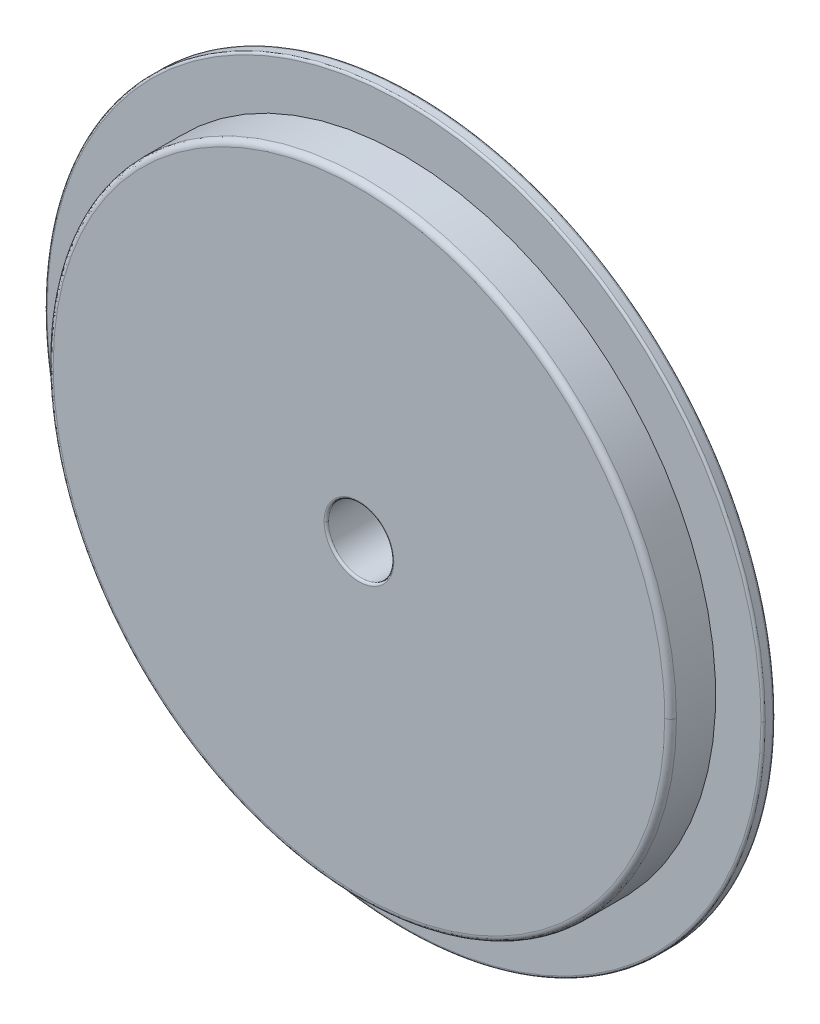
ISO-10303-21;
HEADER;
FILE_DESCRIPTION(('STEP AP214'),'2;1');
FILE_NAME('part.step','',(''),(''),'','','');
FILE_SCHEMA(('AUTOMOTIVE_DESIGN { 1 0 10303 214 1 1 1 1 }'));
ENDSEC;
DATA;
#1=APPLICATION_CONTEXT('core data for automotive mechanical design processes');
#2=APPLICATION_PROTOCOL_DEFINITION('international standard','automotive_design',2000,#1);
#3=PRODUCT_CONTEXT('',#1,'mechanical');
#4=PRODUCT('Part','Part','',(#3));
#5=PRODUCT_RELATED_PRODUCT_CATEGORY('part','',(#4));
#6=PRODUCT_DEFINITION_FORMATION('','',#4);
#7=PRODUCT_DEFINITION_CONTEXT('part definition',#1,'design');
#8=PRODUCT_DEFINITION('design','',#6,#7);
#9=PRODUCT_DEFINITION_SHAPE('','',#8);
#10=(LENGTH_UNIT() NAMED_UNIT(*) SI_UNIT(.MILLI.,.METRE.));
#11=(NAMED_UNIT(*) PLANE_ANGLE_UNIT() SI_UNIT($,.RADIAN.));
#12=(NAMED_UNIT(*) SI_UNIT($,.STERADIAN.) SOLID_ANGLE_UNIT());
#13=UNCERTAINTY_MEASURE_WITH_UNIT(LENGTH_MEASURE(1.E-05),#10,'distance_accuracy_value','');
#14=(GEOMETRIC_REPRESENTATION_CONTEXT(3) GLOBAL_UNCERTAINTY_ASSIGNED_CONTEXT((#13)) GLOBAL_UNIT_ASSIGNED_CONTEXT((#10,
#11,#12)) REPRESENTATION_CONTEXT('',''));
#15=CARTESIAN_POINT('',(0.,0.,0.));
#16=DIRECTION('',(0.,0.,1.));
#17=DIRECTION('',(1.,0.,0.));
#18=AXIS2_PLACEMENT_3D('',#15,#16,#17);
#19=CARTESIAN_POINT('',(-50.4984392112,0.,1.3327900446));
#20=CARTESIAN_POINT('',(-50.4984392112,100.996878397,1.3327900446));
#21=CARTESIAN_POINT('',(50.4984392112,100.996878397,1.3327900446));
#22=CARTESIAN_POINT('',(50.4984392112,0.,1.3327900446));
#23=CARTESIAN_POINT('',(-50.5197513352,0.,1.5452003894));
#24=CARTESIAN_POINT('',(-50.5197513352,101.039502645,1.5452003894));
#25=CARTESIAN_POINT('',(50.5197513352,101.039502645,1.5452003894));
#26=CARTESIAN_POINT('',(50.5197513352,0.,1.5452003894));
#27=CARTESIAN_POINT('',(-50.3688004052,0.,1.6961513194));
#28=CARTESIAN_POINT('',(-50.3688004052,100.737600785,1.6961513194));
#29=CARTESIAN_POINT('',(50.3688004052,100.737600785,1.6961513194));
#30=CARTESIAN_POINT('',(50.3688004052,0.,1.6961513194));
#31=CARTESIAN_POINT('',(-50.156390035,0.,1.6748391954));
#32=CARTESIAN_POINT('',(-50.156390035,100.3127800954,1.6748391954));
#33=CARTESIAN_POINT('',(50.156390035,100.3127800954,1.6748391954));
#34=CARTESIAN_POINT('',(50.156390035,0.,1.6748391954));
#35=(BOUNDED_SURFACE() B_SPLINE_SURFACE(3,3,((#19,#20,#21,#22),(#23,#24,#25,#26),(#27,#28,#29,
#30),(#31,#32,#33,#34)),.UNSPECIFIED.,.F.,.F.,.F.) B_SPLINE_SURFACE_WITH_KNOTS((4,4),(4,4),(0.,
1.),(0.,1.),.UNSPECIFIED.) GEOMETRIC_REPRESENTATION_ITEM() RATIONAL_B_SPLINE_SURFACE(((1.,
0.333333333333333,0.333333333333333,1.),(0.755320871117975,0.251773623705992,0.251773623705992,
0.755320871117975),(0.755320871117975,0.251773623705992,0.251773623705992,0.755320871117975),
(1.,0.333333333333333,0.333333333333333,1.))) REPRESENTATION_ITEM('') SURFACE());
#36=CARTESIAN_POINT('',(0.,0.,1.36398));
#37=DIRECTION('',(0.,0.,-1.));
#38=DIRECTION('',(-1.,0.,0.));
#39=AXIS2_PLACEMENT_3D('',#36,#37,#38);
#40=CIRCLE('',#39,50.4999999904);
#41=CARTESIAN_POINT('',(50.4999999952931,-1.55365847070829E-08,1.36397999989946));
#42=VERTEX_POINT('',#41);
#43=CARTESIAN_POINT('',(-50.4999999952931,-4.534578234789E-09,1.36397999989946));
#44=VERTEX_POINT('',#43);
#45=EDGE_CURVE('E351',#42,#44,#40,.F.);
#46=CARTESIAN_POINT('',(-50.4984392112,0.,1.3327900446));
#47=CARTESIAN_POINT('',(-50.5197513352,0.,1.5452003894));
#48=CARTESIAN_POINT('',(-50.3688004052,0.,1.6961513194));
#49=CARTESIAN_POINT('',(-50.156390035,0.,1.6748391954));
#50=(BOUNDED_CURVE() B_SPLINE_CURVE(3,(#46,#47,#48,#49),.UNSPECIFIED.,.F.,
.F.) B_SPLINE_CURVE_WITH_KNOTS((4,4),(0.,1.),
.UNSPECIFIED.) CURVE() GEOMETRIC_REPRESENTATION_ITEM() RATIONAL_B_SPLINE_CURVE((1.,
0.755320871117975,0.755320871117975,1.)) REPRESENTATION_ITEM(''));
#51=CARTESIAN_POINT('',(-50.1875799769011,0.,1.67639999650745));
#52=VERTEX_POINT('',#51);
#53=EDGE_CURVE('E96',#52,#44,#50,.F.);
#54=CARTESIAN_POINT('',(-50.1875799727355,0.,1.67639999417908));
#55=CARTESIAN_POINT('',(-50.1875799727355,100.375159963739,1.67639999417908));
#56=CARTESIAN_POINT('',(50.1875799727355,100.375159963739,1.67639999417908));
#57=CARTESIAN_POINT('',(50.1875799727355,0.,1.67639999417908));
#58=(BOUNDED_CURVE() B_SPLINE_CURVE(3,(#54,#55,#56,#57),.UNSPECIFIED.,.F.,
.F.) B_SPLINE_CURVE_WITH_KNOTS((4,4),(0.,1.),
.UNSPECIFIED.) CURVE() GEOMETRIC_REPRESENTATION_ITEM() RATIONAL_B_SPLINE_CURVE((0.95657832858148,
0.318859442860493,0.318859442860493,0.95657832858148)) REPRESENTATION_ITEM(''));
#59=CARTESIAN_POINT('',(50.1875799769011,0.,1.67639999650745));
#60=VERTEX_POINT('',#59);
#61=EDGE_CURVE('E90',#52,#60,#58,.T.);
#62=CARTESIAN_POINT('',(50.4984392112,0.,1.3327900446));
#63=CARTESIAN_POINT('',(50.5197513352,0.,1.5452003894));
#64=CARTESIAN_POINT('',(50.3688004052,0.,1.6961513194));
#65=CARTESIAN_POINT('',(50.156390035,0.,1.6748391954));
#66=(BOUNDED_CURVE() B_SPLINE_CURVE(3,(#62,#63,#64,#65),.UNSPECIFIED.,.F.,
.F.) B_SPLINE_CURVE_WITH_KNOTS((4,4),(0.,1.),
.UNSPECIFIED.) CURVE() GEOMETRIC_REPRESENTATION_ITEM() RATIONAL_B_SPLINE_CURVE((1.,
0.755320871117975,0.755320871117975,1.)) REPRESENTATION_ITEM(''));
#67=EDGE_CURVE('E93',#42,#60,#66,.T.);
#68=ORIENTED_EDGE('',*,*,#45,.T.);
#69=ORIENTED_EDGE('',*,*,#53,.F.);
#70=ORIENTED_EDGE('',*,*,#61,.T.);
#71=ORIENTED_EDGE('',*,*,#67,.F.);
#72=EDGE_LOOP('',(#68,#69,#70,#71));
#73=FACE_BOUND('',#72,.T.);
#74=ADVANCED_FACE('F16',(#73),#35,.T.);
#75=CARTESIAN_POINT('',(50.4984392112,0.,1.3327900446));
#76=CARTESIAN_POINT('',(50.4984392112,-100.996878397,1.3327900446));
#77=CARTESIAN_POINT('',(-50.4984392112,-100.996878397,1.3327900446));
#78=CARTESIAN_POINT('',(-50.4984392112,0.,1.3327900446));
#79=CARTESIAN_POINT('',(50.5197513352,0.,1.5452003894));
#80=CARTESIAN_POINT('',(50.5197513352,-101.039502645,1.5452003894));
#81=CARTESIAN_POINT('',(-50.5197513352,-101.039502645,1.5452003894));
#82=CARTESIAN_POINT('',(-50.5197513352,0.,1.5452003894));
#83=CARTESIAN_POINT('',(50.3688004052,0.,1.6961513194));
#84=CARTESIAN_POINT('',(50.3688004052,-100.737600785,1.6961513194));
#85=CARTESIAN_POINT('',(-50.3688004052,-100.737600785,1.6961513194));
#86=CARTESIAN_POINT('',(-50.3688004052,0.,1.6961513194));
#87=CARTESIAN_POINT('',(50.156390035,0.,1.6748391954));
#88=CARTESIAN_POINT('',(50.156390035,-100.3127800954,1.6748391954));
#89=CARTESIAN_POINT('',(-50.156390035,-100.3127800954,1.6748391954));
#90=CARTESIAN_POINT('',(-50.156390035,0.,1.6748391954));
#91=(BOUNDED_SURFACE() B_SPLINE_SURFACE(3,3,((#75,#76,#77,#78),(#79,#80,#81,#82),(#83,#84,#85,
#86),(#87,#88,#89,#90)),.UNSPECIFIED.,.F.,.F.,.F.) B_SPLINE_SURFACE_WITH_KNOTS((4,4),(4,4),(0.,
1.),(0.,1.),.UNSPECIFIED.) GEOMETRIC_REPRESENTATION_ITEM() RATIONAL_B_SPLINE_SURFACE(((1.,
0.333333333333333,0.333333333333333,1.),(0.755320871117975,0.251773623705992,0.251773623705992,
0.755320871117975),(0.755320871117975,0.251773623705992,0.251773623705992,0.755320871117975),
(1.,0.333333333333333,0.333333333333333,1.))) REPRESENTATION_ITEM('') SURFACE());
#92=CARTESIAN_POINT('',(0.,0.,1.36398));
#93=DIRECTION('',(0.,0.,-1.));
#94=DIRECTION('',(-1.,0.,0.));
#95=AXIS2_PLACEMENT_3D('',#92,#93,#94);
#96=CIRCLE('',#95,50.4999999904);
#97=EDGE_CURVE('E102',#44,#42,#96,.F.);
#98=CARTESIAN_POINT('',(50.1875799727355,0.,1.67639999417908));
#99=CARTESIAN_POINT('',(50.1875799727355,-100.375159963739,1.67639999417908));
#100=CARTESIAN_POINT('',(-50.1875799727355,-100.375159963739,1.67639999417908));
#101=CARTESIAN_POINT('',(-50.1875799727355,0.,1.67639999417908));
#102=(BOUNDED_CURVE() B_SPLINE_CURVE(3,(#98,#99,#100,#101),.UNSPECIFIED.,.F.,
.F.) B_SPLINE_CURVE_WITH_KNOTS((4,4),(0.,1.),
.UNSPECIFIED.) CURVE() GEOMETRIC_REPRESENTATION_ITEM() RATIONAL_B_SPLINE_CURVE((0.95657832858148,
0.318859442860493,0.318859442860493,0.95657832858148)) REPRESENTATION_ITEM(''));
#103=EDGE_CURVE('E101',#60,#52,#102,.T.);
#104=ORIENTED_EDGE('',*,*,#53,.T.);
#105=ORIENTED_EDGE('',*,*,#97,.T.);
#106=ORIENTED_EDGE('',*,*,#67,.T.);
#107=ORIENTED_EDGE('',*,*,#103,.T.);
#108=EDGE_LOOP('',(#104,#105,#106,#107));
#109=FACE_BOUND('',#108,.T.);
#110=ADVANCED_FACE('F106',(#109),#91,.T.);
#111=CARTESIAN_POINT('',(0.,0.,1.36398));
#112=DIRECTION('',(0.,0.,-1.));
#113=DIRECTION('',(-1.,0.,0.));
#114=AXIS2_PLACEMENT_3D('',#111,#112,#113);
#115=CYLINDRICAL_SURFACE('',#114,50.4999999904);
#116=ORIENTED_EDGE('',*,*,#97,.F.);
#117=ORIENTED_EDGE('',*,*,#45,.F.);
#118=EDGE_LOOP('',(#116,#117));
#119=FACE_BOUND('',#118,.T.);
#120=CARTESIAN_POINT('',(0.,0.,0.312420000402175));
#121=DIRECTION('',(0.,0.,-1.));
#122=DIRECTION('',(0.,1.,0.));
#123=AXIS2_PLACEMENT_3D('',#120,#121,#122);
#124=CIRCLE('',#123,50.5000000099724);
#125=CARTESIAN_POINT('',(-50.5000000050793,-2.2672891173945E-09,0.312420000301631));
#126=VERTEX_POINT('',#125);
#127=CARTESIAN_POINT('',(50.5000000050793,-5.17886156902762E-09,0.312420000402175));
#128=VERTEX_POINT('',#127);
#129=EDGE_CURVE('E113',#126,#128,#124,.T.);
#130=ORIENTED_EDGE('',*,*,#129,.F.);
#131=CARTESIAN_POINT('',(0.,0.,0.312420000402175));
#132=DIRECTION('',(0.,0.,-1.));
#133=DIRECTION('',(0.,1.,0.));
#134=AXIS2_PLACEMENT_3D('',#131,#132,#133);
#135=CIRCLE('',#134,50.5000000099724);
#136=EDGE_CURVE('E337',#128,#126,#135,.T.);
#137=ORIENTED_EDGE('',*,*,#136,.F.);
#138=EDGE_LOOP('',(#130,#137));
#139=FACE_BOUND('',#138,.T.);
#140=ADVANCED_FACE('F132',(#119,#139),#115,.T.);
#141=CARTESIAN_POINT('',(50.7898309576,-50.7898309576,1.6764));
#142=DIRECTION('',(0.,0.,-1.));
#143=DIRECTION('',(-1.,0.,0.));
#144=AXIS2_PLACEMENT_3D('',#141,#142,#143);
#145=PLANE('',#144);
#146=CARTESIAN_POINT('',(0.,0.,1.6764));
#147=DIRECTION('',(0.,0.,-1.));
#148=DIRECTION('',(0.,1.,0.));
#149=AXIS2_PLACEMENT_3D('',#146,#147,#148);
#150=CIRCLE('',#149,43.8250000054);
#151=CARTESIAN_POINT('',(0.,43.8250000054,1.6764));
#152=VERTEX_POINT('',#151);
#153=EDGE_CURVE('E21',#152,#152,#150,.T.);
#154=ORIENTED_EDGE('',*,*,#153,.T.);
#155=EDGE_LOOP('',(#154));
#156=FACE_BOUND('',#155,.T.);
#157=ORIENTED_EDGE('',*,*,#61,.F.);
#158=ORIENTED_EDGE('',*,*,#103,.F.);
#159=EDGE_LOOP('',(#157,#158));
#160=FACE_BOUND('',#159,.T.);
#161=ADVANCED_FACE('F112',(#156,#160),#145,.F.);
#162=CARTESIAN_POINT('',(-50.156390035,0.,0.0015608046));
#163=CARTESIAN_POINT('',(-50.156390035,100.3127800954,0.0015608046));
#164=CARTESIAN_POINT('',(50.156390035,100.3127800954,0.0015608046));
#165=CARTESIAN_POINT('',(50.156390035,0.,0.0015608046));
#166=CARTESIAN_POINT('',(-50.3688004052,0.,-0.0197513194));
#167=CARTESIAN_POINT('',(-50.3688004052,100.737600785,-0.0197513194));
#168=CARTESIAN_POINT('',(50.3688004052,100.737600785,-0.0197513194));
#169=CARTESIAN_POINT('',(50.3688004052,0.,-0.0197513194));
#170=CARTESIAN_POINT('',(-50.5197513352,0.,0.1311996106));
#171=CARTESIAN_POINT('',(-50.5197513352,101.039502645,0.1311996106));
#172=CARTESIAN_POINT('',(50.5197513352,101.039502645,0.1311996106));
#173=CARTESIAN_POINT('',(50.5197513352,0.,0.1311996106));
#174=CARTESIAN_POINT('',(-50.4984392112,0.,0.3436099554));
#175=CARTESIAN_POINT('',(-50.4984392112,100.996878397,0.3436099554));
#176=CARTESIAN_POINT('',(50.4984392112,100.996878397,0.3436099554));
#177=CARTESIAN_POINT('',(50.4984392112,0.,0.3436099554));
#178=(BOUNDED_SURFACE() B_SPLINE_SURFACE(3,3,((#162,#163,#164,#165),(#166,#167,#168,#169),(#170,
#171,#172,#173),(#174,#175,#176,#177)),.UNSPECIFIED.,.F.,.F.,
.F.) B_SPLINE_SURFACE_WITH_KNOTS((4,4),(4,4),(0.,1.),(0.,1.),
.UNSPECIFIED.) GEOMETRIC_REPRESENTATION_ITEM() RATIONAL_B_SPLINE_SURFACE(((1.,0.333333333333333,
0.333333333333333,1.),(0.755320871117975,0.251773623705992,0.251773623705992,0.755320871117975),
(0.755320871117975,0.251773623705992,0.251773623705992,0.755320871117975),(1.,0.333333333333333,
0.333333333333333,1.))) REPRESENTATION_ITEM('') SURFACE());
#179=CARTESIAN_POINT('',(50.1875799727355,0.,5.82091631601305E-09));
#180=CARTESIAN_POINT('',(50.1875799727355,100.375159963739,5.82091631283E-09));
#181=CARTESIAN_POINT('',(-50.1875799727355,100.375159963739,5.82091631283E-09));
#182=CARTESIAN_POINT('',(-50.1875799727355,0.,5.82091631601305E-09));
#183=(BOUNDED_CURVE() B_SPLINE_CURVE(3,(#179,#180,#181,#182),.UNSPECIFIED.,.F.,
.F.) B_SPLINE_CURVE_WITH_KNOTS((4,4),(0.,1.),
.UNSPECIFIED.) CURVE() GEOMETRIC_REPRESENTATION_ITEM() RATIONAL_B_SPLINE_CURVE((0.956578328581488,
0.318859442860496,0.318859442860496,0.956578328581488)) REPRESENTATION_ITEM(''));
#184=CARTESIAN_POINT('',(-50.1875799769011,0.,3.49254964327249E-09));
#185=VERTEX_POINT('',#184);
#186=CARTESIAN_POINT('',(50.1875799769011,0.,3.49254964327249E-09));
#187=VERTEX_POINT('',#186);
#188=EDGE_CURVE('E324',#185,#187,#183,.F.);
#189=CARTESIAN_POINT('',(-50.156390035,0.,0.0015608046));
#190=CARTESIAN_POINT('',(-50.3688004052,0.,-0.0197513194));
#191=CARTESIAN_POINT('',(-50.5197513352,0.,0.1311996106));
#192=CARTESIAN_POINT('',(-50.4984392112,0.,0.3436099554));
#193=(BOUNDED_CURVE() B_SPLINE_CURVE(3,(#189,#190,#191,#192),.UNSPECIFIED.,.F.,
.F.) B_SPLINE_CURVE_WITH_KNOTS((4,4),(0.,1.),
.UNSPECIFIED.) CURVE() GEOMETRIC_REPRESENTATION_ITEM() RATIONAL_B_SPLINE_CURVE((1.,
0.755320871117975,0.755320871117975,1.)) REPRESENTATION_ITEM(''));
#194=EDGE_CURVE('E340',#126,#185,#193,.F.);
#195=CARTESIAN_POINT('',(50.156390035,0.,0.0015608046));
#196=CARTESIAN_POINT('',(50.3688004052,0.,-0.0197513194));
#197=CARTESIAN_POINT('',(50.5197513352,0.,0.1311996106));
#198=CARTESIAN_POINT('',(50.4984392112,0.,0.3436099554));
#199=(BOUNDED_CURVE() B_SPLINE_CURVE(3,(#195,#196,#197,#198),.UNSPECIFIED.,.F.,
.F.) B_SPLINE_CURVE_WITH_KNOTS((4,4),(0.,1.),
.UNSPECIFIED.) CURVE() GEOMETRIC_REPRESENTATION_ITEM() RATIONAL_B_SPLINE_CURVE((1.,
0.755320871117975,0.755320871117975,1.)) REPRESENTATION_ITEM(''));
#200=EDGE_CURVE('E268',#187,#128,#199,.T.);
#201=ORIENTED_EDGE('',*,*,#188,.F.);
#202=ORIENTED_EDGE('',*,*,#194,.F.);
#203=ORIENTED_EDGE('',*,*,#129,.T.);
#204=ORIENTED_EDGE('',*,*,#200,.F.);
#205=EDGE_LOOP('',(#201,#202,#203,#204));
#206=FACE_BOUND('',#205,.T.);
#207=ADVANCED_FACE('F131',(#206),#178,.T.);
#208=CARTESIAN_POINT('',(50.156390035,0.,0.0015608046));
#209=CARTESIAN_POINT('',(50.156390035,-100.3127800954,0.0015608046));
#210=CARTESIAN_POINT('',(-50.156390035,-100.3127800954,0.0015608046));
#211=CARTESIAN_POINT('',(-50.156390035,0.,0.0015608046));
#212=CARTESIAN_POINT('',(50.3688004052,0.,-0.0197513194));
#213=CARTESIAN_POINT('',(50.3688004052,-100.737600785,-0.0197513194));
#214=CARTESIAN_POINT('',(-50.3688004052,-100.737600785,-0.0197513194));
#215=CARTESIAN_POINT('',(-50.3688004052,0.,-0.0197513194));
#216=CARTESIAN_POINT('',(50.5197513352,0.,0.1311996106));
#217=CARTESIAN_POINT('',(50.5197513352,-101.039502645,0.1311996106));
#218=CARTESIAN_POINT('',(-50.5197513352,-101.039502645,0.1311996106));
#219=CARTESIAN_POINT('',(-50.5197513352,0.,0.1311996106));
#220=CARTESIAN_POINT('',(50.4984392112,0.,0.3436099554));
#221=CARTESIAN_POINT('',(50.4984392112,-100.996878397,0.3436099554));
#222=CARTESIAN_POINT('',(-50.4984392112,-100.996878397,0.3436099554));
#223=CARTESIAN_POINT('',(-50.4984392112,0.,0.3436099554));
#224=(BOUNDED_SURFACE() B_SPLINE_SURFACE(3,3,((#208,#209,#210,#211),(#212,#213,#214,#215),(#216,
#217,#218,#219),(#220,#221,#222,#223)),.UNSPECIFIED.,.F.,.F.,
.F.) B_SPLINE_SURFACE_WITH_KNOTS((4,4),(4,4),(0.,1.),(0.,1.),
.UNSPECIFIED.) GEOMETRIC_REPRESENTATION_ITEM() RATIONAL_B_SPLINE_SURFACE(((1.,0.333333333333333,
0.333333333333333,1.),(0.755320871117975,0.251773623705992,0.251773623705992,0.755320871117975),
(0.755320871117975,0.251773623705992,0.251773623705992,0.755320871117975),(1.,0.333333333333333,
0.333333333333333,1.))) REPRESENTATION_ITEM('') SURFACE());
#225=CARTESIAN_POINT('',(-50.1875799727355,0.,5.82091631601305E-09));
#226=CARTESIAN_POINT('',(-50.1875799727355,-100.375159963739,5.82091631283E-09));
#227=CARTESIAN_POINT('',(50.1875799727355,-100.375159963739,5.82091631283E-09));
#228=CARTESIAN_POINT('',(50.1875799727355,0.,5.82091631601305E-09));
#229=(BOUNDED_CURVE() B_SPLINE_CURVE(3,(#225,#226,#227,#228),.UNSPECIFIED.,.F.,
.F.) B_SPLINE_CURVE_WITH_KNOTS((4,4),(0.,1.),
.UNSPECIFIED.) CURVE() GEOMETRIC_REPRESENTATION_ITEM() RATIONAL_B_SPLINE_CURVE((0.956578328581488,
0.318859442860496,0.318859442860496,0.956578328581488)) REPRESENTATION_ITEM(''));
#230=EDGE_CURVE('E169',#187,#185,#229,.F.);
#231=ORIENTED_EDGE('',*,*,#194,.T.);
#232=ORIENTED_EDGE('',*,*,#230,.F.);
#233=ORIENTED_EDGE('',*,*,#200,.T.);
#234=ORIENTED_EDGE('',*,*,#136,.T.);
#235=EDGE_LOOP('',(#231,#232,#233,#234));
#236=FACE_BOUND('',#235,.T.);
#237=ADVANCED_FACE('F293',(#236),#224,.T.);
#238=CARTESIAN_POINT('',(0.,0.,7.1909999944));
#239=DIRECTION('',(0.,0.,-1.));
#240=DIRECTION('',(0.,1.,0.));
#241=AXIS2_PLACEMENT_3D('',#238,#239,#240);
#242=CYLINDRICAL_SURFACE('',#241,43.8250000054);
#243=CARTESIAN_POINT('',(0.,0.,7.19099999784297));
#244=DIRECTION('',(0.,0.,1.));
#245=DIRECTION('',(0.,-1.,0.));
#246=AXIS2_PLACEMENT_3D('',#243,#244,#245);
#247=CIRCLE('',#246,43.8249999980767);
#248=CARTESIAN_POINT('',(-43.8249999999075,-1.96760288318706E-09,7.19099999784297));
#249=VERTEX_POINT('',#248);
#250=CARTESIAN_POINT('',(43.8249999999075,-4.49432887789597E-09,7.19099999698223));
#251=VERTEX_POINT('',#250);
#252=EDGE_CURVE('E252',#249,#251,#247,.T.);
#253=ORIENTED_EDGE('',*,*,#252,.F.);
#254=CARTESIAN_POINT('',(0.,0.,7.19099999784297));
#255=DIRECTION('',(0.,0.,1.));
#256=DIRECTION('',(0.,-1.,0.));
#257=AXIS2_PLACEMENT_3D('',#254,#255,#256);
#258=CIRCLE('',#257,43.8249999980767);
#259=EDGE_CURVE('E246',#251,#249,#258,.T.);
#260=ORIENTED_EDGE('',*,*,#259,.F.);
#261=EDGE_LOOP('',(#253,#260));
#262=FACE_BOUND('',#261,.T.);
#263=ORIENTED_EDGE('',*,*,#153,.F.);
#264=EDGE_LOOP('',(#263));
#265=FACE_BOUND('',#264,.T.);
#266=ADVANCED_FACE('F143',(#262,#265),#242,.T.);
#267=CARTESIAN_POINT('',(50.7898309576,-50.7898309576,0.));
#268=DIRECTION('',(0.,0.,-1.));
#269=DIRECTION('',(-1.,0.,0.));
#270=AXIS2_PLACEMENT_3D('',#267,#268,#269);
#271=PLANE('',#270);
#272=CARTESIAN_POINT('',(4.84400000971187,0.,-6.90271291198202E-09));
#273=CARTESIAN_POINT('',(4.84400000971187,-9.68799999758965,-6.90271291389432E-09));
#274=CARTESIAN_POINT('',(-4.84400000971187,-9.68799999758965,-6.90271291389432E-09));
#275=CARTESIAN_POINT('',(-4.84400000971187,0.,-6.90271291198202E-09));
#276=(BOUNDED_CURVE() B_SPLINE_CURVE(3,(#272,#273,#274,#275),.UNSPECIFIED.,.F.,
.F.) B_SPLINE_CURVE_WITH_KNOTS((4,4),(0.,1.),
.UNSPECIFIED.) CURVE() GEOMETRIC_REPRESENTATION_ITEM() RATIONAL_B_SPLINE_CURVE((0.956578302165916,
0.318859434055305,0.318859434055305,0.956578302165916)) REPRESENTATION_ITEM(''));
#277=CARTESIAN_POINT('',(4.84399999831827,0.,-4.14162774707223E-09));
#278=VERTEX_POINT('',#277);
#279=CARTESIAN_POINT('',(-4.84399999831828,0.,-4.14162774707223E-09));
#280=VERTEX_POINT('',#279);
#281=EDGE_CURVE('E249',#278,#280,#276,.T.);
#282=ORIENTED_EDGE('',*,*,#281,.F.);
#283=CARTESIAN_POINT('',(-4.84400000971187,0.,-6.90271291198202E-09));
#284=CARTESIAN_POINT('',(-4.84400000971187,9.68799999758965,-6.90271291389432E-09));
#285=CARTESIAN_POINT('',(4.84400000971187,9.68799999758965,-6.90271291389432E-09));
#286=CARTESIAN_POINT('',(4.84400000971187,0.,-6.90271291198202E-09));
#287=(BOUNDED_CURVE() B_SPLINE_CURVE(3,(#283,#284,#285,#286),.UNSPECIFIED.,.F.,
.F.) B_SPLINE_CURVE_WITH_KNOTS((4,4),(0.,1.),
.UNSPECIFIED.) CURVE() GEOMETRIC_REPRESENTATION_ITEM() RATIONAL_B_SPLINE_CURVE((0.956578302165916,
0.318859434055305,0.318859434055305,0.956578302165916)) REPRESENTATION_ITEM(''));
#288=EDGE_CURVE('E410',#280,#278,#287,.T.);
#289=ORIENTED_EDGE('',*,*,#288,.F.);
#290=EDGE_LOOP('',(#282,#289));
#291=FACE_BOUND('',#290,.T.);
#292=ORIENTED_EDGE('',*,*,#188,.T.);
#293=ORIENTED_EDGE('',*,*,#230,.T.);
#294=EDGE_LOOP('',(#292,#293));
#295=FACE_BOUND('',#294,.T.);
#296=ADVANCED_FACE('F138',(#291,#295),#271,.T.);
#297=CARTESIAN_POINT('',(4.591268948,0.,0.2793576836));
#298=CARTESIAN_POINT('',(4.591268948,-9.182537896,0.2793576836));
#299=CARTESIAN_POINT('',(-4.591268948,-9.182537896,0.2793576836));
#300=CARTESIAN_POINT('',(-4.591268948,0.,0.2793576836));
#301=CARTESIAN_POINT('',(4.5739420078,0.,0.1066663348));
#302=CARTESIAN_POINT('',(4.5739420078,-9.1478840156,0.1066663348));
#303=CARTESIAN_POINT('',(-4.5739420078,-9.1478840156,0.1066663348));
#304=CARTESIAN_POINT('',(-4.5739420078,0.,0.1066663348));
#305=CARTESIAN_POINT('',(4.6966663496,0.,-0.0160579816));
#306=CARTESIAN_POINT('',(4.6966663496,-9.3933326992,-0.0160579816));
#307=CARTESIAN_POINT('',(-4.6966663496,-9.3933326992,-0.0160579816));
#308=CARTESIAN_POINT('',(-4.6966663496,0.,-0.0160579816));
#309=CARTESIAN_POINT('',(4.8693576984,0.,0.0012689332));
#310=CARTESIAN_POINT('',(4.8693576984,-9.7387153714,0.0012689332));
#311=CARTESIAN_POINT('',(-4.8693576984,-9.7387153714,0.0012689332));
#312=CARTESIAN_POINT('',(-4.8693576984,0.,0.0012689332));
#313=(BOUNDED_SURFACE() B_SPLINE_SURFACE(3,3,((#297,#298,#299,#300),(#301,#302,#303,#304),(#305,
#306,#307,#308),(#309,#310,#311,#312)),.UNSPECIFIED.,.F.,.F.,
.F.) B_SPLINE_SURFACE_WITH_KNOTS((4,4),(4,4),(0.,1.),(0.,1.),
.UNSPECIFIED.) GEOMETRIC_REPRESENTATION_ITEM() RATIONAL_B_SPLINE_SURFACE(((1.,0.333333333333333,
0.333333333333333,1.),(0.755320871117972,0.251773623705991,0.251773623705991,0.755320871117972),
(0.755320871117972,0.251773623705991,0.251773623705991,0.755320871117972),(1.,0.333333333333333,
0.333333333333333,1.))) REPRESENTATION_ITEM('') SURFACE());
#314=CARTESIAN_POINT('',(-4.591268948,0.,0.2793576836));
#315=CARTESIAN_POINT('',(-4.5739420078,0.,0.1066663348));
#316=CARTESIAN_POINT('',(-4.6966663496,0.,-0.0160579816));
#317=CARTESIAN_POINT('',(-4.8693576984,0.,0.0012689332));
#318=(BOUNDED_CURVE() B_SPLINE_CURVE(3,(#314,#315,#316,#317),.UNSPECIFIED.,.F.,
.F.) B_SPLINE_CURVE_WITH_KNOTS((4,4),(0.,1.),
.UNSPECIFIED.) CURVE() GEOMETRIC_REPRESENTATION_ITEM() RATIONAL_B_SPLINE_CURVE((1.,
0.755320871117972,0.755320871117972,1.)) REPRESENTATION_ITEM(''));
#319=CARTESIAN_POINT('',(-4.58999999887675,-7.06068551033455E-10,0.25399999696041));
#320=VERTEX_POINT('',#319);
#321=EDGE_CURVE('E234',#320,#280,#318,.T.);
#322=CARTESIAN_POINT('',(0.,0.,0.254));
#323=DIRECTION('',(0.,0.,1.));
#324=DIRECTION('',(1.,0.,0.));
#325=AXIS2_PLACEMENT_3D('',#322,#323,#324);
#326=CIRCLE('',#325,4.5899999894);
#327=CARTESIAN_POINT('',(4.5900000007721,-1.03038188384018E-10,0.253999996352492));
#328=VERTEX_POINT('',#327);
#329=EDGE_CURVE('E229',#328,#320,#326,.F.);
#330=CARTESIAN_POINT('',(4.591268948,0.,0.2793576836));
#331=CARTESIAN_POINT('',(4.5739420078,0.,0.1066663348));
#332=CARTESIAN_POINT('',(4.6966663496,0.,-0.0160579816));
#333=CARTESIAN_POINT('',(4.8693576984,0.,0.0012689332));
#334=(BOUNDED_CURVE() B_SPLINE_CURVE(3,(#330,#331,#332,#333),.UNSPECIFIED.,.F.,
.F.) B_SPLINE_CURVE_WITH_KNOTS((4,4),(0.,1.),
.UNSPECIFIED.) CURVE() GEOMETRIC_REPRESENTATION_ITEM() RATIONAL_B_SPLINE_CURVE((1.,
0.755320871117972,0.755320871117972,1.)) REPRESENTATION_ITEM(''));
#335=EDGE_CURVE('E497',#278,#328,#334,.F.);
#336=ORIENTED_EDGE('',*,*,#321,.F.);
#337=ORIENTED_EDGE('',*,*,#329,.F.);
#338=ORIENTED_EDGE('',*,*,#335,.F.);
#339=ORIENTED_EDGE('',*,*,#281,.T.);
#340=EDGE_LOOP('',(#336,#337,#338,#339));
#341=FACE_BOUND('',#340,.T.);
#342=ADVANCED_FACE('F142',(#341),#313,.T.);
#343=CARTESIAN_POINT('',(42.917087521,0.,8.0123759488));
#344=CARTESIAN_POINT('',(42.917087521,85.8341750166,8.0123759488));
#345=CARTESIAN_POINT('',(-42.917087521,85.8341750166,8.0123759488));
#346=CARTESIAN_POINT('',(-42.917087521,0.,8.0123759488));
#347=CARTESIAN_POINT('',(43.4783343792,0.,8.06868846));
#348=CARTESIAN_POINT('',(43.4783343792,86.9566687584,8.06868846));
#349=CARTESIAN_POINT('',(-43.4783343792,86.9566687584,8.06868846));
#350=CARTESIAN_POINT('',(-43.4783343792,0.,8.06868846));
#351=CARTESIAN_POINT('',(43.877188471,0.,7.6698343936));
#352=CARTESIAN_POINT('',(43.877188471,87.7543769166,7.6698343936));
#353=CARTESIAN_POINT('',(-43.877188471,87.7543769166,7.6698343936));
#354=CARTESIAN_POINT('',(-43.877188471,0.,7.6698343936));
#355=CARTESIAN_POINT('',(43.8208759344,0.,7.10858751));
#356=CARTESIAN_POINT('',(43.8208759344,87.6417518688,7.10858751));
#357=CARTESIAN_POINT('',(-43.8208759344,87.6417518688,7.10858751));
#358=CARTESIAN_POINT('',(-43.8208759344,0.,7.10858751));
#359=(BOUNDED_SURFACE() B_SPLINE_SURFACE(3,3,((#343,#344,#345,#346),(#347,#348,#349,#350),(#351,
#352,#353,#354),(#355,#356,#357,#358)),.UNSPECIFIED.,.F.,.F.,
.F.) B_SPLINE_SURFACE_WITH_KNOTS((4,4),(4,4),(0.,1.),(0.,1.),
.UNSPECIFIED.) GEOMETRIC_REPRESENTATION_ITEM() RATIONAL_B_SPLINE_SURFACE(((1.,0.333333333333333,
0.333333333333333,1.),(0.755320871117973,0.251773623705991,0.251773623705991,0.755320871117973),
(0.755320871117973,0.251773623705991,0.251773623705991,0.755320871117973),(1.,0.333333333333333,
0.333333333333333,1.))) REPRESENTATION_ITEM('') SURFACE());
#360=CARTESIAN_POINT('',(-42.9995000110546,0.,8.01650000913555));
#361=CARTESIAN_POINT('',(-42.9995000110546,85.9990000000503,8.01650000913555));
#362=CARTESIAN_POINT('',(42.9995000110546,85.9990000000503,8.01650000913555));
#363=CARTESIAN_POINT('',(42.9995000110546,0.,8.01650000913555));
#364=(BOUNDED_CURVE() B_SPLINE_CURVE(3,(#360,#361,#362,#363),.UNSPECIFIED.,.F.,
.F.) B_SPLINE_CURVE_WITH_KNOTS((4,4),(0.,1.),
.UNSPECIFIED.) CURVE() GEOMETRIC_REPRESENTATION_ITEM() RATIONAL_B_SPLINE_CURVE((0.956578299500752,
0.318859433166917,0.318859433166917,0.956578299500752)) REPRESENTATION_ITEM(''));
#365=CARTESIAN_POINT('',(42.9994999950148,0.,8.01650000324133));
#366=VERTEX_POINT('',#365);
#367=CARTESIAN_POINT('',(-42.9994999950148,0.,8.01650000324133));
#368=VERTEX_POINT('',#367);
#369=EDGE_CURVE('E205',#366,#368,#364,.F.);
#370=CARTESIAN_POINT('',(42.917087521,0.,8.0123759488));
#371=CARTESIAN_POINT('',(43.4783343792,0.,8.06868846));
#372=CARTESIAN_POINT('',(43.877188471,0.,7.6698343936));
#373=CARTESIAN_POINT('',(43.8208759344,0.,7.10858751));
#374=(BOUNDED_CURVE() B_SPLINE_CURVE(3,(#370,#371,#372,#373),.UNSPECIFIED.,.F.,
.F.) B_SPLINE_CURVE_WITH_KNOTS((4,4),(0.,1.),
.UNSPECIFIED.) CURVE() GEOMETRIC_REPRESENTATION_ITEM() RATIONAL_B_SPLINE_CURVE((1.,
0.755320871117973,0.755320871117973,1.)) REPRESENTATION_ITEM(''));
#375=EDGE_CURVE('E255',#251,#366,#374,.F.);
#376=CARTESIAN_POINT('',(-42.917087521,0.,8.0123759488));
#377=CARTESIAN_POINT('',(-43.4783343792,0.,8.06868846));
#378=CARTESIAN_POINT('',(-43.877188471,0.,7.6698343936));
#379=CARTESIAN_POINT('',(-43.8208759344,0.,7.10858751));
#380=(BOUNDED_CURVE() B_SPLINE_CURVE(3,(#376,#377,#378,#379),.UNSPECIFIED.,.F.,
.F.) B_SPLINE_CURVE_WITH_KNOTS((4,4),(0.,1.),
.UNSPECIFIED.) CURVE() GEOMETRIC_REPRESENTATION_ITEM() RATIONAL_B_SPLINE_CURVE((1.,
0.755320871117973,0.755320871117973,1.)) REPRESENTATION_ITEM(''));
#381=EDGE_CURVE('E248',#368,#249,#380,.T.);
#382=ORIENTED_EDGE('',*,*,#369,.F.);
#383=ORIENTED_EDGE('',*,*,#375,.F.);
#384=ORIENTED_EDGE('',*,*,#259,.T.);
#385=ORIENTED_EDGE('',*,*,#381,.F.);
#386=EDGE_LOOP('',(#382,#383,#384,#385));
#387=FACE_BOUND('',#386,.T.);
#388=ADVANCED_FACE('F281',(#387),#359,.T.);
#389=CARTESIAN_POINT('',(-42.917087521,0.,8.0123759488));
#390=CARTESIAN_POINT('',(-42.917087521,-85.8341750166,8.0123759488));
#391=CARTESIAN_POINT('',(42.917087521,-85.8341750166,8.0123759488));
#392=CARTESIAN_POINT('',(42.917087521,0.,8.0123759488));
#393=CARTESIAN_POINT('',(-43.4783343792,0.,8.06868846));
#394=CARTESIAN_POINT('',(-43.4783343792,-86.9566687584,8.06868846));
#395=CARTESIAN_POINT('',(43.4783343792,-86.9566687584,8.06868846));
#396=CARTESIAN_POINT('',(43.4783343792,0.,8.06868846));
#397=CARTESIAN_POINT('',(-43.877188471,0.,7.6698343936));
#398=CARTESIAN_POINT('',(-43.877188471,-87.7543769166,7.6698343936));
#399=CARTESIAN_POINT('',(43.877188471,-87.7543769166,7.6698343936));
#400=CARTESIAN_POINT('',(43.877188471,0.,7.6698343936));
#401=CARTESIAN_POINT('',(-43.8208759344,0.,7.10858751));
#402=CARTESIAN_POINT('',(-43.8208759344,-87.6417518688,7.10858751));
#403=CARTESIAN_POINT('',(43.8208759344,-87.6417518688,7.10858751));
#404=CARTESIAN_POINT('',(43.8208759344,0.,7.10858751));
#405=(BOUNDED_SURFACE() B_SPLINE_SURFACE(3,3,((#389,#390,#391,#392),(#393,#394,#395,#396),(#397,
#398,#399,#400),(#401,#402,#403,#404)),.UNSPECIFIED.,.F.,.F.,
.F.) B_SPLINE_SURFACE_WITH_KNOTS((4,4),(4,4),(0.,1.),(0.,1.),
.UNSPECIFIED.) GEOMETRIC_REPRESENTATION_ITEM() RATIONAL_B_SPLINE_SURFACE(((1.,0.333333333333333,
0.333333333333333,1.),(0.755320871117973,0.251773623705991,0.251773623705991,0.755320871117973),
(0.755320871117973,0.251773623705991,0.251773623705991,0.755320871117973),(1.,0.333333333333333,
0.333333333333333,1.))) REPRESENTATION_ITEM('') SURFACE());
#406=CARTESIAN_POINT('',(42.9995000110546,0.,8.01650000913554));
#407=CARTESIAN_POINT('',(42.9995000110546,-85.9990000000503,8.01650000913554));
#408=CARTESIAN_POINT('',(-42.9995000110546,-85.9990000000503,8.01650000913554));
#409=CARTESIAN_POINT('',(-42.9995000110546,0.,8.01650000913554));
#410=(BOUNDED_CURVE() B_SPLINE_CURVE(3,(#406,#407,#408,#409),.UNSPECIFIED.,.F.,
.F.) B_SPLINE_CURVE_WITH_KNOTS((4,4),(0.,1.),
.UNSPECIFIED.) CURVE() GEOMETRIC_REPRESENTATION_ITEM() RATIONAL_B_SPLINE_CURVE((0.956578299500751,
0.318859433166917,0.318859433166917,0.956578299500751)) REPRESENTATION_ITEM(''));
#411=EDGE_CURVE('E215',#368,#366,#410,.F.);
#412=ORIENTED_EDGE('',*,*,#375,.T.);
#413=ORIENTED_EDGE('',*,*,#411,.F.);
#414=ORIENTED_EDGE('',*,*,#381,.T.);
#415=ORIENTED_EDGE('',*,*,#252,.T.);
#416=EDGE_LOOP('',(#412,#413,#414,#415));
#417=FACE_BOUND('',#416,.T.);
#418=ADVANCED_FACE('F443',(#417),#405,.T.);
#419=CARTESIAN_POINT('',(-4.591560794,0.,7.672890039));
#420=CARTESIAN_POINT('',(-4.591560794,-9.183121588,7.672890039));
#421=CARTESIAN_POINT('',(4.591560794,-9.183121588,7.672890039));
#422=CARTESIAN_POINT('',(4.591560794,0.,7.672890039));
#423=CARTESIAN_POINT('',(-4.57024867,0.,7.8853004092));
#424=CARTESIAN_POINT('',(-4.57024867,-9.14049734,7.8853004092));
#425=CARTESIAN_POINT('',(4.57024867,-9.14049734,7.8853004092));
#426=CARTESIAN_POINT('',(4.57024867,0.,7.8853004092));
#427=CARTESIAN_POINT('',(-4.7211996,0.,8.0362513138));
#428=CARTESIAN_POINT('',(-4.7211996,-9.4423992,8.0362513138));
#429=CARTESIAN_POINT('',(4.7211996,-9.4423992,8.0362513138));
#430=CARTESIAN_POINT('',(4.7211996,0.,8.0362513138));
#431=CARTESIAN_POINT('',(-4.9336099448,0.,8.01493918980001));
#432=CARTESIAN_POINT('',(-4.9336099448,-9.867219915,8.01493918980001));
#433=CARTESIAN_POINT('',(4.9336099448,-9.867219915,8.01493918980001));
#434=CARTESIAN_POINT('',(4.9336099448,0.,8.01493918980001));
#435=(BOUNDED_SURFACE() B_SPLINE_SURFACE(3,3,((#419,#420,#421,#422),(#423,#424,#425,#426),(#427,
#428,#429,#430),(#431,#432,#433,#434)),.UNSPECIFIED.,.F.,.F.,
.F.) B_SPLINE_SURFACE_WITH_KNOTS((4,4),(4,4),(0.,1.),(0.,1.),
.UNSPECIFIED.) GEOMETRIC_REPRESENTATION_ITEM() RATIONAL_B_SPLINE_SURFACE(((1.,0.333333333333333,
0.333333333333333,1.),(0.755320871117972,0.251773623705991,0.251773623705991,0.755320871117972),
(0.755320871117972,0.251773623705991,0.251773623705991,0.755320871117972),(1.,0.333333333333333,
0.333333333333333,1.))) REPRESENTATION_ITEM('') SURFACE());
#436=CARTESIAN_POINT('',(4.591560794,0.,7.672890039));
#437=CARTESIAN_POINT('',(4.57024867,0.,7.8853004092));
#438=CARTESIAN_POINT('',(4.7211996,0.,8.0362513138));
#439=CARTESIAN_POINT('',(4.9336099448,0.,8.01493918980001));
#440=(BOUNDED_CURVE() B_SPLINE_CURVE(3,(#436,#437,#438,#439),.UNSPECIFIED.,.F.,
.F.) B_SPLINE_CURVE_WITH_KNOTS((4,4),(0.,1.),
.UNSPECIFIED.) CURVE() GEOMETRIC_REPRESENTATION_ITEM() RATIONAL_B_SPLINE_CURVE((1.,
0.755320871117972,0.755320871117972,1.)) REPRESENTATION_ITEM(''));
#441=CARTESIAN_POINT('',(4.90241997060241,0.,8.01649999104229));
#442=VERTEX_POINT('',#441);
#443=CARTESIAN_POINT('',(4.58999999522092,0.,7.70407999733231));
#444=VERTEX_POINT('',#443);
#445=EDGE_CURVE('E36',#442,#444,#440,.F.);
#446=CARTESIAN_POINT('',(0.,0.,7.7040799944));
#447=DIRECTION('',(0.,0.,1.));
#448=DIRECTION('',(1.,0.,0.));
#449=AXIS2_PLACEMENT_3D('',#446,#447,#448);
#450=CIRCLE('',#449,4.5899999894);
#451=CARTESIAN_POINT('',(-4.58999999328061,-4.70712367281019E-10,7.70407999635488));
#452=VERTEX_POINT('',#451);
#453=EDGE_CURVE('E228',#452,#444,#450,.T.);
#454=CARTESIAN_POINT('',(-4.591560794,0.,7.672890039));
#455=CARTESIAN_POINT('',(-4.57024867,0.,7.8853004092));
#456=CARTESIAN_POINT('',(-4.7211996,0.,8.0362513138));
#457=CARTESIAN_POINT('',(-4.9336099448,0.,8.01493918980001));
#458=(BOUNDED_CURVE() B_SPLINE_CURVE(3,(#454,#455,#456,#457),.UNSPECIFIED.,.F.,
.F.) B_SPLINE_CURVE_WITH_KNOTS((4,4),(0.,1.),
.UNSPECIFIED.) CURVE() GEOMETRIC_REPRESENTATION_ITEM() RATIONAL_B_SPLINE_CURVE((1.,
0.755320871117972,0.755320871117972,1.)) REPRESENTATION_ITEM(''));
#459=CARTESIAN_POINT('',(-4.90241997060241,0.,8.01649999104229));
#460=VERTEX_POINT('',#459);
#461=EDGE_CURVE('E411',#452,#460,#458,.T.);
#462=CARTESIAN_POINT('',(-4.90241995780255,0.,8.01649998880382));
#463=CARTESIAN_POINT('',(-4.90241995780255,-9.80483993743919,8.01649998880383));
#464=CARTESIAN_POINT('',(4.90241995780255,-9.80483993743919,8.01649998880383));
#465=CARTESIAN_POINT('',(4.90241995780255,0.,8.01649998880382));
#466=(BOUNDED_CURVE() B_SPLINE_CURVE(3,(#462,#463,#464,#465),.UNSPECIFIED.,.F.,
.F.) B_SPLINE_CURVE_WITH_KNOTS((4,4),(0.,1.),
.UNSPECIFIED.) CURVE() GEOMETRIC_REPRESENTATION_ITEM() RATIONAL_B_SPLINE_CURVE((0.956578261582357,
0.318859420527452,0.318859420527452,0.956578261582357)) REPRESENTATION_ITEM(''));
#467=EDGE_CURVE('E182',#442,#460,#466,.F.);
#468=ORIENTED_EDGE('',*,*,#445,.T.);
#469=ORIENTED_EDGE('',*,*,#453,.F.);
#470=ORIENTED_EDGE('',*,*,#461,.T.);
#471=ORIENTED_EDGE('',*,*,#467,.F.);
#472=EDGE_LOOP('',(#468,#469,#470,#471));
#473=FACE_BOUND('',#472,.T.);
#474=ADVANCED_FACE('F432',(#473),#435,.T.);
#475=CARTESIAN_POINT('',(-4.591268948,0.,0.2793576836));
#476=CARTESIAN_POINT('',(-4.591268948,9.182537896,0.2793576836));
#477=CARTESIAN_POINT('',(4.591268948,9.182537896,0.2793576836));
#478=CARTESIAN_POINT('',(4.591268948,0.,0.2793576836));
#479=CARTESIAN_POINT('',(-4.5739420078,0.,0.1066663348));
#480=CARTESIAN_POINT('',(-4.5739420078,9.1478840156,0.1066663348));
#481=CARTESIAN_POINT('',(4.5739420078,9.1478840156,0.1066663348));
#482=CARTESIAN_POINT('',(4.5739420078,0.,0.1066663348));
#483=CARTESIAN_POINT('',(-4.6966663496,0.,-0.0160579816));
#484=CARTESIAN_POINT('',(-4.6966663496,9.3933326992,-0.0160579816));
#485=CARTESIAN_POINT('',(4.6966663496,9.3933326992,-0.0160579816));
#486=CARTESIAN_POINT('',(4.6966663496,0.,-0.0160579816));
#487=CARTESIAN_POINT('',(-4.8693576984,0.,0.0012689332));
#488=CARTESIAN_POINT('',(-4.8693576984,9.7387153714,0.0012689332));
#489=CARTESIAN_POINT('',(4.8693576984,9.7387153714,0.0012689332));
#490=CARTESIAN_POINT('',(4.8693576984,0.,0.0012689332));
#491=(BOUNDED_SURFACE() B_SPLINE_SURFACE(3,3,((#475,#476,#477,#478),(#479,#480,#481,#482),(#483,
#484,#485,#486),(#487,#488,#489,#490)),.UNSPECIFIED.,.F.,.F.,
.F.) B_SPLINE_SURFACE_WITH_KNOTS((4,4),(4,4),(0.,1.),(0.,1.),
.UNSPECIFIED.) GEOMETRIC_REPRESENTATION_ITEM() RATIONAL_B_SPLINE_SURFACE(((1.,0.333333333333333,
0.333333333333333,1.),(0.755320871117972,0.251773623705991,0.251773623705991,0.755320871117972),
(0.755320871117972,0.251773623705991,0.251773623705991,0.755320871117972),(1.,0.333333333333333,
0.333333333333333,1.))) REPRESENTATION_ITEM('') SURFACE());
#492=CARTESIAN_POINT('',(0.,0.,0.254));
#493=DIRECTION('',(0.,0.,1.));
#494=DIRECTION('',(1.,0.,0.));
#495=AXIS2_PLACEMENT_3D('',#492,#493,#494);
#496=CIRCLE('',#495,4.5899999894);
#497=EDGE_CURVE('E227',#320,#328,#496,.F.);
#498=ORIENTED_EDGE('',*,*,#497,.F.);
#499=ORIENTED_EDGE('',*,*,#321,.T.);
#500=ORIENTED_EDGE('',*,*,#288,.T.);
#501=ORIENTED_EDGE('',*,*,#335,.T.);
#502=EDGE_LOOP('',(#498,#499,#500,#501));
#503=FACE_BOUND('',#502,.T.);
#504=ADVANCED_FACE('F442',(#503),#491,.T.);
#505=CARTESIAN_POINT('',(-43.515493995,-43.515493995,8.0164999944));
#506=DIRECTION('',(0.,0.,1.));
#507=DIRECTION('',(1.,0.,0.));
#508=AXIS2_PLACEMENT_3D('',#505,#506,#507);
#509=PLANE('',#508);
#510=ORIENTED_EDGE('',*,*,#467,.T.);
#511=CARTESIAN_POINT('',(4.90241998980212,0.,8.01649998880382));
#512=CARTESIAN_POINT('',(4.90241998980212,9.80484000143833,8.01649998880382));
#513=CARTESIAN_POINT('',(-4.90241998980212,9.80484000143833,8.01649998880382));
#514=CARTESIAN_POINT('',(-4.90241998980212,0.,8.01649998880382));
#515=(BOUNDED_CURVE() B_SPLINE_CURVE(3,(#511,#512,#513,#514),.UNSPECIFIED.,.F.,
.F.) B_SPLINE_CURVE_WITH_KNOTS((4,4),(0.,1.),
.UNSPECIFIED.) CURVE() GEOMETRIC_REPRESENTATION_ITEM() RATIONAL_B_SPLINE_CURVE((0.956578302165917,
0.318859434055306,0.318859434055306,0.956578302165917)) REPRESENTATION_ITEM(''));
#516=EDGE_CURVE('E27',#442,#460,#515,.T.);
#517=ORIENTED_EDGE('',*,*,#516,.F.);
#518=EDGE_LOOP('',(#510,#517));
#519=FACE_BOUND('',#518,.T.);
#520=ORIENTED_EDGE('',*,*,#369,.T.);
#521=ORIENTED_EDGE('',*,*,#411,.T.);
#522=EDGE_LOOP('',(#520,#521));
#523=FACE_BOUND('',#522,.T.);
#524=ADVANCED_FACE('F18',(#519,#523),#509,.T.);
#525=CARTESIAN_POINT('',(0.,0.,0.254));
#526=DIRECTION('',(0.,0.,1.));
#527=DIRECTION('',(0.,-1.,0.));
#528=AXIS2_PLACEMENT_3D('',#525,#526,#527);
#529=CYLINDRICAL_SURFACE('',#528,4.5899999894);
#530=ORIENTED_EDGE('',*,*,#329,.T.);
#531=ORIENTED_EDGE('',*,*,#497,.T.);
#532=EDGE_LOOP('',(#530,#531));
#533=FACE_BOUND('',#532,.T.);
#534=CARTESIAN_POINT('',(0.,0.,7.70407999733231));
#535=DIRECTION('',(0.,0.,-1.));
#536=DIRECTION('',(0.,1.,0.));
#537=AXIS2_PLACEMENT_3D('',#534,#535,#536);
#538=CIRCLE('',#537,4.58999999522092);
#539=EDGE_CURVE('E11',#452,#444,#538,.T.);
#540=ORIENTED_EDGE('',*,*,#539,.F.);
#541=ORIENTED_EDGE('',*,*,#453,.T.);
#542=EDGE_LOOP('',(#540,#541));
#543=FACE_BOUND('',#542,.T.);
#544=ADVANCED_FACE('F382',(#533,#543),#529,.F.);
#545=CARTESIAN_POINT('',(4.591560794,0.,7.672890039));
#546=CARTESIAN_POINT('',(4.591560794,9.183121588,7.672890039));
#547=CARTESIAN_POINT('',(-4.591560794,9.183121588,7.672890039));
#548=CARTESIAN_POINT('',(-4.591560794,0.,7.672890039));
#549=CARTESIAN_POINT('',(4.57024867,0.,7.8853004092));
#550=CARTESIAN_POINT('',(4.57024867,9.14049734,7.8853004092));
#551=CARTESIAN_POINT('',(-4.57024867,9.14049734,7.8853004092));
#552=CARTESIAN_POINT('',(-4.57024867,0.,7.8853004092));
#553=CARTESIAN_POINT('',(4.7211996,0.,8.0362513138));
#554=CARTESIAN_POINT('',(4.7211996,9.4423992,8.0362513138));
#555=CARTESIAN_POINT('',(-4.7211996,9.4423992,8.0362513138));
#556=CARTESIAN_POINT('',(-4.7211996,0.,8.0362513138));
#557=CARTESIAN_POINT('',(4.9336099448,0.,8.01493918980001));
#558=CARTESIAN_POINT('',(4.9336099448,9.867219915,8.01493918980001));
#559=CARTESIAN_POINT('',(-4.9336099448,9.867219915,8.01493918980001));
#560=CARTESIAN_POINT('',(-4.9336099448,0.,8.01493918980001));
#561=(BOUNDED_SURFACE() B_SPLINE_SURFACE(3,3,((#545,#546,#547,#548),(#549,#550,#551,#552),(#553,
#554,#555,#556),(#557,#558,#559,#560)),.UNSPECIFIED.,.F.,.F.,
.F.) B_SPLINE_SURFACE_WITH_KNOTS((4,4),(4,4),(0.,1.),(0.,1.),
.UNSPECIFIED.) GEOMETRIC_REPRESENTATION_ITEM() RATIONAL_B_SPLINE_SURFACE(((1.,0.333333333333333,
0.333333333333333,1.),(0.755320871117972,0.251773623705991,0.251773623705991,0.755320871117972),
(0.755320871117972,0.251773623705991,0.251773623705991,0.755320871117972),(1.,0.333333333333333,
0.333333333333333,1.))) REPRESENTATION_ITEM('') SURFACE());
#562=ORIENTED_EDGE('',*,*,#539,.T.);
#563=ORIENTED_EDGE('',*,*,#445,.F.);
#564=ORIENTED_EDGE('',*,*,#516,.T.);
#565=ORIENTED_EDGE('',*,*,#461,.F.);
#566=EDGE_LOOP('',(#562,#563,#564,#565));
#567=FACE_BOUND('',#566,.T.);
#568=ADVANCED_FACE('F380',(#567),#561,.T.);
#569=CLOSED_SHELL('',(#74,#110,#140,#161,#207,#237,#266,#296,#342,#388,#418,#474,#504,#524,#544,#568));
#570=MANIFOLD_SOLID_BREP('B1',#569);
#571=ADVANCED_BREP_SHAPE_REPRESENTATION('',(#18,#570),#14);
#572=SHAPE_DEFINITION_REPRESENTATION(#9,#571);
ENDSEC;
END-ISO-10303-21;
